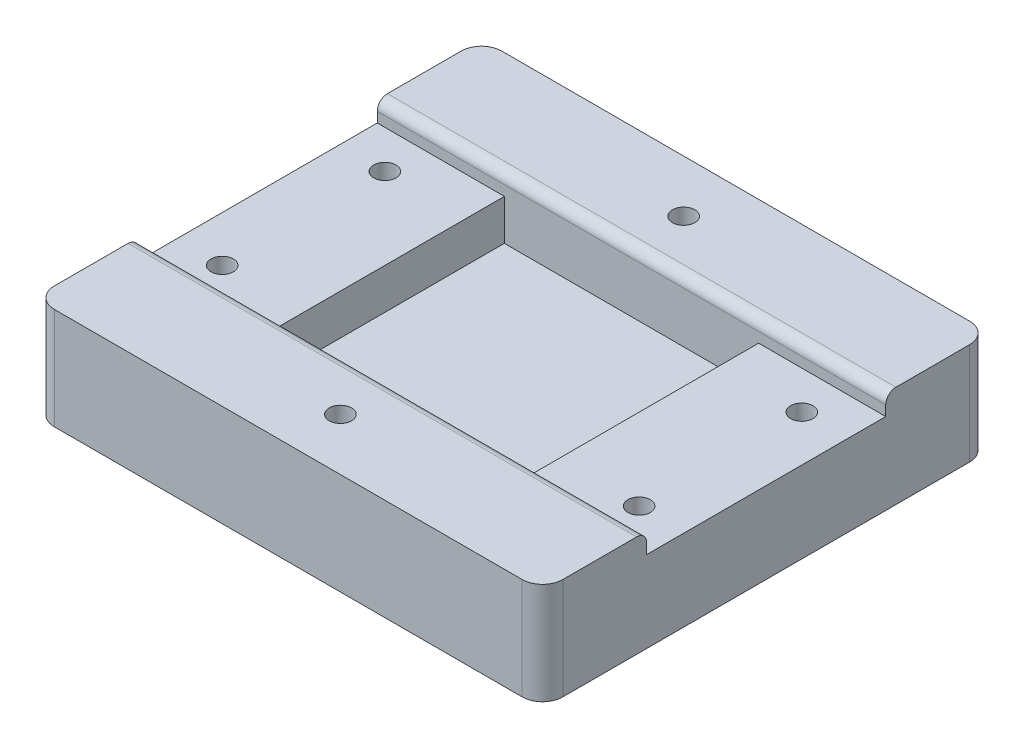
ISO-10303-21;
HEADER;
FILE_DESCRIPTION(('STEP AP214'),'2;1');
FILE_NAME('part.step','',(''),(''),'','','');
FILE_SCHEMA(('AUTOMOTIVE_DESIGN { 1 0 10303 214 1 1 1 1 }'));
ENDSEC;
DATA;
#1=APPLICATION_CONTEXT('core data for automotive mechanical design processes');
#2=APPLICATION_PROTOCOL_DEFINITION('international standard','automotive_design',2000,#1);
#3=PRODUCT_CONTEXT('',#1,'mechanical');
#4=PRODUCT('Part','Part','',(#3));
#5=PRODUCT_RELATED_PRODUCT_CATEGORY('part','',(#4));
#6=PRODUCT_DEFINITION_FORMATION('','',#4);
#7=PRODUCT_DEFINITION_CONTEXT('part definition',#1,'design');
#8=PRODUCT_DEFINITION('design','',#6,#7);
#9=PRODUCT_DEFINITION_SHAPE('','',#8);
#10=(LENGTH_UNIT() NAMED_UNIT(*) SI_UNIT(.MILLI.,.METRE.));
#11=(NAMED_UNIT(*) PLANE_ANGLE_UNIT() SI_UNIT($,.RADIAN.));
#12=(NAMED_UNIT(*) SI_UNIT($,.STERADIAN.) SOLID_ANGLE_UNIT());
#13=UNCERTAINTY_MEASURE_WITH_UNIT(LENGTH_MEASURE(1.E-05),#10,'distance_accuracy_value','');
#14=(GEOMETRIC_REPRESENTATION_CONTEXT(3) GLOBAL_UNCERTAINTY_ASSIGNED_CONTEXT((#13)) GLOBAL_UNIT_ASSIGNED_CONTEXT((#10,
#11,#12)) REPRESENTATION_CONTEXT('',''));
#15=CARTESIAN_POINT('',(0.,0.,0.));
#16=DIRECTION('',(0.,0.,1.));
#17=DIRECTION('',(1.,0.,0.));
#18=AXIS2_PLACEMENT_3D('',#15,#16,#17);
#19=CARTESIAN_POINT('',(0.,8.,0.));
#20=DIRECTION('',(0.,1.,0.));
#21=DIRECTION('',(0.,0.,1.));
#22=AXIS2_PLACEMENT_3D('',#19,#20,#21);
#23=PLANE('',#22);
#24=CARTESIAN_POINT('',(-20.5,8.,-8.));
#25=DIRECTION('',(0.,1.,0.));
#26=DIRECTION('',(0.,0.,1.));
#27=AXIS2_PLACEMENT_3D('',#24,#25,#26);
#28=CIRCLE('',#27,1.1);
#29=CARTESIAN_POINT('',(-20.5,8.,-6.9));
#30=VERTEX_POINT('',#29);
#31=EDGE_CURVE('E713',#30,#30,#28,.T.);
#32=ORIENTED_EDGE('',*,*,#31,.F.);
#33=EDGE_LOOP('',(#32));
#34=FACE_BOUND('',#33,.T.);
#35=CARTESIAN_POINT('',(-20.5,8.,8.));
#36=DIRECTION('',(0.,1.,0.));
#37=DIRECTION('',(0.,0.,1.));
#38=AXIS2_PLACEMENT_3D('',#35,#36,#37);
#39=CIRCLE('',#38,1.1);
#40=CARTESIAN_POINT('',(-20.5,8.,9.1));
#41=VERTEX_POINT('',#40);
#42=EDGE_CURVE('E199',#41,#41,#39,.T.);
#43=ORIENTED_EDGE('',*,*,#42,.F.);
#44=EDGE_LOOP('',(#43));
#45=FACE_BOUND('',#44,.T.);
#46=DIRECTION('',(0.,0.,1.));
#47=VECTOR('',#46,1.);
#48=CARTESIAN_POINT('',(-12.5,8.,11.75));
#49=LINE('',#48,#47);
#50=CARTESIAN_POINT('',(-12.5,8.,-11.75));
#51=VERTEX_POINT('',#50);
#52=CARTESIAN_POINT('',(-12.5,8.,11.75));
#53=VERTEX_POINT('',#52);
#54=EDGE_CURVE('E171',#51,#53,#49,.T.);
#55=ORIENTED_EDGE('',*,*,#54,.F.);
#56=DIRECTION('',(-1.,0.,0.));
#57=VECTOR('',#56,1.);
#58=CARTESIAN_POINT('',(29.,8.,-11.75));
#59=LINE('',#58,#57);
#60=CARTESIAN_POINT('',(-25.,8.,-11.75));
#61=VERTEX_POINT('',#60);
#62=EDGE_CURVE('E221',#51,#61,#59,.T.);
#63=ORIENTED_EDGE('',*,*,#62,.T.);
#64=DIRECTION('',(0.,0.,1.));
#65=VECTOR('',#64,1.);
#66=CARTESIAN_POINT('',(-25.,8.,22.));
#67=LINE('',#66,#65);
#68=CARTESIAN_POINT('',(-25.,8.,11.75));
#69=VERTEX_POINT('',#68);
#70=EDGE_CURVE('E239',#61,#69,#67,.T.);
#71=ORIENTED_EDGE('',*,*,#70,.T.);
#72=DIRECTION('',(1.,0.,0.));
#73=VECTOR('',#72,1.);
#74=CARTESIAN_POINT('',(29.,8.,11.75));
#75=LINE('',#74,#73);
#76=EDGE_CURVE('E218',#69,#53,#75,.T.);
#77=ORIENTED_EDGE('',*,*,#76,.T.);
#78=EDGE_LOOP('',(#55,#63,#71,#77));
#79=FACE_BOUND('',#78,.T.);
#80=ADVANCED_FACE('F38',(#34,#45,#79),#23,.T.);
#81=CARTESIAN_POINT('',(0.,10.,0.));
#82=DIRECTION('',(0.,1.,0.));
#83=DIRECTION('',(0.,0.,1.));
#84=AXIS2_PLACEMENT_3D('',#81,#82,#83);
#85=PLANE('',#84);
#86=CARTESIAN_POINT('',(0.,10.,-16.875));
#87=DIRECTION('',(0.,1.,0.));
#88=DIRECTION('',(0.,0.,1.));
#89=AXIS2_PLACEMENT_3D('',#86,#87,#88);
#90=CIRCLE('',#89,1.1);
#91=CARTESIAN_POINT('',(0.,10.,-15.775));
#92=VERTEX_POINT('',#91);
#93=EDGE_CURVE('E699',#92,#92,#90,.T.);
#94=ORIENTED_EDGE('',*,*,#93,.F.);
#95=EDGE_LOOP('',(#94));
#96=FACE_BOUND('',#95,.T.);
#97=DIRECTION('',(0.,0.,1.));
#98=VECTOR('',#97,1.);
#99=CARTESIAN_POINT('',(-25.,10.,22.));
#100=LINE('',#99,#98);
#101=CARTESIAN_POINT('',(-25.,10.,-20.));
#102=VERTEX_POINT('',#101);
#103=CARTESIAN_POINT('',(-25.,10.,-12.75));
#104=VERTEX_POINT('',#103);
#105=EDGE_CURVE('E244',#102,#104,#100,.T.);
#106=ORIENTED_EDGE('',*,*,#105,.T.);
#107=DIRECTION('',(-1.,0.,0.));
#108=VECTOR('',#107,1.);
#109=CARTESIAN_POINT('',(25.,10.,-12.75));
#110=LINE('',#109,#108);
#111=CARTESIAN_POINT('',(25.,10.,-12.75));
#112=VERTEX_POINT('',#111);
#113=EDGE_CURVE('E11',#104,#112,#110,.F.);
#114=ORIENTED_EDGE('',*,*,#113,.T.);
#115=DIRECTION('',(0.,0.,-1.));
#116=VECTOR('',#115,1.);
#117=CARTESIAN_POINT('',(25.,10.,22.));
#118=LINE('',#117,#116);
#119=CARTESIAN_POINT('',(25.,10.,-20.));
#120=VERTEX_POINT('',#119);
#121=EDGE_CURVE('E252',#112,#120,#118,.T.);
#122=ORIENTED_EDGE('',*,*,#121,.T.);
#123=CARTESIAN_POINT('',(23.,10.,-20.));
#124=DIRECTION('',(0.,1.,0.));
#125=DIRECTION('',(0.,0.,1.));
#126=AXIS2_PLACEMENT_3D('',#123,#124,#125);
#127=CIRCLE('',#126,2.);
#128=CARTESIAN_POINT('',(23.,10.,-22.));
#129=VERTEX_POINT('',#128);
#130=EDGE_CURVE('E307',#120,#129,#127,.T.);
#131=ORIENTED_EDGE('',*,*,#130,.T.);
#132=DIRECTION('',(-1.,0.,0.));
#133=VECTOR('',#132,1.);
#134=CARTESIAN_POINT('',(25.,10.,-22.));
#135=LINE('',#134,#133);
#136=CARTESIAN_POINT('',(-23.,10.,-22.));
#137=VERTEX_POINT('',#136);
#138=EDGE_CURVE('E257',#129,#137,#135,.T.);
#139=ORIENTED_EDGE('',*,*,#138,.T.);
#140=CARTESIAN_POINT('',(-23.,10.,-20.));
#141=DIRECTION('',(0.,1.,0.));
#142=DIRECTION('',(0.,0.,1.));
#143=AXIS2_PLACEMENT_3D('',#140,#141,#142);
#144=CIRCLE('',#143,2.);
#145=EDGE_CURVE('E310',#137,#102,#144,.T.);
#146=ORIENTED_EDGE('',*,*,#145,.T.);
#147=EDGE_LOOP('',(#106,#114,#122,#131,#139,#146));
#148=FACE_BOUND('',#147,.T.);
#149=ADVANCED_FACE('F398',(#96,#148),#85,.T.);
#150=CARTESIAN_POINT('',(-25.,10.,22.));
#151=DIRECTION('',(1.,0.,0.));
#152=DIRECTION('',(0.,0.,-1.));
#153=AXIS2_PLACEMENT_3D('',#150,#151,#152);
#154=PLANE('',#153);
#155=CARTESIAN_POINT('',(-25.,10.,12.75));
#156=VERTEX_POINT('',#155);
#157=CARTESIAN_POINT('',(-25.,10.,20.));
#158=VERTEX_POINT('',#157);
#159=EDGE_CURVE('E248',#156,#158,#100,.T.);
#160=ORIENTED_EDGE('',*,*,#159,.F.);
#161=CARTESIAN_POINT('',(-25.,9.,12.75));
#162=DIRECTION('',(1.,0.,0.));
#163=DIRECTION('',(0.,0.,-1.));
#164=AXIS2_PLACEMENT_3D('',#161,#162,#163);
#165=CIRCLE('',#164,1.);
#166=CARTESIAN_POINT('',(-25.,9.,11.75));
#167=VERTEX_POINT('',#166);
#168=EDGE_CURVE('E349',#156,#167,#165,.F.);
#169=ORIENTED_EDGE('',*,*,#168,.T.);
#170=DIRECTION('',(0.,-1.,0.));
#171=VECTOR('',#170,1.);
#172=CARTESIAN_POINT('',(-25.,10.,11.75));
#173=LINE('',#172,#171);
#174=EDGE_CURVE('E230',#167,#69,#173,.T.);
#175=ORIENTED_EDGE('',*,*,#174,.T.);
#176=ORIENTED_EDGE('',*,*,#70,.F.);
#177=DIRECTION('',(0.,1.,0.));
#178=VECTOR('',#177,1.);
#179=CARTESIAN_POINT('',(-25.,10.,-11.75));
#180=LINE('',#179,#178);
#181=CARTESIAN_POINT('',(-25.,9.,-11.75));
#182=VERTEX_POINT('',#181);
#183=EDGE_CURVE('E236',#61,#182,#180,.T.);
#184=ORIENTED_EDGE('',*,*,#183,.T.);
#185=CARTESIAN_POINT('',(-25.,9.,-12.75));
#186=DIRECTION('',(1.,0.,0.));
#187=DIRECTION('',(0.,0.,-1.));
#188=AXIS2_PLACEMENT_3D('',#185,#186,#187);
#189=CIRCLE('',#188,1.);
#190=EDGE_CURVE('E54',#182,#104,#189,.F.);
#191=ORIENTED_EDGE('',*,*,#190,.T.);
#192=ORIENTED_EDGE('',*,*,#105,.F.);
#193=DIRECTION('',(0.,-1.,0.));
#194=VECTOR('',#193,1.);
#195=CARTESIAN_POINT('',(-25.,10.,-20.));
#196=LINE('',#195,#194);
#197=CARTESIAN_POINT('',(-25.,0.,-20.));
#198=VERTEX_POINT('',#197);
#199=EDGE_CURVE('E284',#102,#198,#196,.T.);
#200=ORIENTED_EDGE('',*,*,#199,.T.);
#201=DIRECTION('',(0.,0.,1.));
#202=VECTOR('',#201,1.);
#203=CARTESIAN_POINT('',(-25.,0.,22.));
#204=LINE('',#203,#202);
#205=CARTESIAN_POINT('',(-25.,0.,20.));
#206=VERTEX_POINT('',#205);
#207=EDGE_CURVE('E243',#198,#206,#204,.T.);
#208=ORIENTED_EDGE('',*,*,#207,.T.);
#209=DIRECTION('',(0.,-1.,0.));
#210=VECTOR('',#209,1.);
#211=CARTESIAN_POINT('',(-25.,10.,20.));
#212=LINE('',#211,#210);
#213=EDGE_CURVE('E280',#206,#158,#212,.F.);
#214=ORIENTED_EDGE('',*,*,#213,.T.);
#215=EDGE_LOOP('',(#160,#169,#175,#176,#184,#191,#192,#200,#208,#214));
#216=FACE_BOUND('',#215,.T.);
#217=ADVANCED_FACE('F361',(#216),#154,.F.);
#218=CARTESIAN_POINT('',(25.,10.,22.));
#219=DIRECTION('',(0.,0.,-1.));
#220=DIRECTION('',(-1.,0.,0.));
#221=AXIS2_PLACEMENT_3D('',#218,#219,#220);
#222=PLANE('',#221);
#223=DIRECTION('',(1.,0.,0.));
#224=VECTOR('',#223,1.);
#225=CARTESIAN_POINT('',(25.,10.,22.));
#226=LINE('',#225,#224);
#227=CARTESIAN_POINT('',(-23.,10.,22.));
#228=VERTEX_POINT('',#227);
#229=CARTESIAN_POINT('',(23.,10.,22.));
#230=VERTEX_POINT('',#229);
#231=EDGE_CURVE('E247',#228,#230,#226,.T.);
#232=ORIENTED_EDGE('',*,*,#231,.F.);
#233=DIRECTION('',(0.,-1.,0.));
#234=VECTOR('',#233,1.);
#235=CARTESIAN_POINT('',(-23.,10.,22.));
#236=LINE('',#235,#234);
#237=CARTESIAN_POINT('',(-23.,0.,22.));
#238=VERTEX_POINT('',#237);
#239=EDGE_CURVE('E316',#228,#238,#236,.T.);
#240=ORIENTED_EDGE('',*,*,#239,.T.);
#241=DIRECTION('',(1.,0.,0.));
#242=VECTOR('',#241,1.);
#243=CARTESIAN_POINT('',(25.,0.,22.));
#244=LINE('',#243,#242);
#245=CARTESIAN_POINT('',(23.,0.,22.));
#246=VERTEX_POINT('',#245);
#247=EDGE_CURVE('E265',#238,#246,#244,.T.);
#248=ORIENTED_EDGE('',*,*,#247,.T.);
#249=DIRECTION('',(0.,-1.,0.));
#250=VECTOR('',#249,1.);
#251=CARTESIAN_POINT('',(23.,10.,22.));
#252=LINE('',#251,#250);
#253=EDGE_CURVE('E313',#246,#230,#252,.F.);
#254=ORIENTED_EDGE('',*,*,#253,.T.);
#255=EDGE_LOOP('',(#232,#240,#248,#254));
#256=FACE_BOUND('',#255,.T.);
#257=ADVANCED_FACE('F408',(#256),#222,.F.);
#258=CARTESIAN_POINT('',(25.,10.,22.));
#259=DIRECTION('',(-1.,0.,0.));
#260=DIRECTION('',(0.,0.,1.));
#261=AXIS2_PLACEMENT_3D('',#258,#259,#260);
#262=PLANE('',#261);
#263=DIRECTION('',(0.,1.,0.));
#264=VECTOR('',#263,1.);
#265=CARTESIAN_POINT('',(25.,10.,11.75));
#266=LINE('',#265,#264);
#267=CARTESIAN_POINT('',(25.,8.,11.75));
#268=VERTEX_POINT('',#267);
#269=CARTESIAN_POINT('',(25.,9.,11.75));
#270=VERTEX_POINT('',#269);
#271=EDGE_CURVE('E226',#268,#270,#266,.T.);
#272=ORIENTED_EDGE('',*,*,#271,.T.);
#273=CARTESIAN_POINT('',(25.,9.,12.75));
#274=DIRECTION('',(-1.,0.,0.));
#275=DIRECTION('',(0.,0.,1.));
#276=AXIS2_PLACEMENT_3D('',#273,#274,#275);
#277=CIRCLE('',#276,1.);
#278=CARTESIAN_POINT('',(25.,10.,12.75));
#279=VERTEX_POINT('',#278);
#280=EDGE_CURVE('E341',#270,#279,#277,.F.);
#281=ORIENTED_EDGE('',*,*,#280,.T.);
#282=CARTESIAN_POINT('',(25.,10.,20.));
#283=VERTEX_POINT('',#282);
#284=EDGE_CURVE('E253',#283,#279,#118,.T.);
#285=ORIENTED_EDGE('',*,*,#284,.F.);
#286=DIRECTION('',(0.,-1.,0.));
#287=VECTOR('',#286,1.);
#288=CARTESIAN_POINT('',(25.,10.,20.));
#289=LINE('',#288,#287);
#290=CARTESIAN_POINT('',(25.,0.,20.));
#291=VERTEX_POINT('',#290);
#292=EDGE_CURVE('E330',#283,#291,#289,.T.);
#293=ORIENTED_EDGE('',*,*,#292,.T.);
#294=DIRECTION('',(0.,0.,-1.));
#295=VECTOR('',#294,1.);
#296=CARTESIAN_POINT('',(25.,0.,22.));
#297=LINE('',#296,#295);
#298=CARTESIAN_POINT('',(25.,0.,-20.));
#299=VERTEX_POINT('',#298);
#300=EDGE_CURVE('E269',#291,#299,#297,.T.);
#301=ORIENTED_EDGE('',*,*,#300,.T.);
#302=DIRECTION('',(0.,-1.,0.));
#303=VECTOR('',#302,1.);
#304=CARTESIAN_POINT('',(25.,10.,-20.));
#305=LINE('',#304,#303);
#306=EDGE_CURVE('E326',#299,#120,#305,.F.);
#307=ORIENTED_EDGE('',*,*,#306,.T.);
#308=ORIENTED_EDGE('',*,*,#121,.F.);
#309=CARTESIAN_POINT('',(25.,9.,-12.75));
#310=DIRECTION('',(-1.,0.,0.));
#311=DIRECTION('',(0.,0.,1.));
#312=AXIS2_PLACEMENT_3D('',#309,#310,#311);
#313=CIRCLE('',#312,1.);
#314=CARTESIAN_POINT('',(25.,9.,-11.75));
#315=VERTEX_POINT('',#314);
#316=EDGE_CURVE('E338',#112,#315,#313,.F.);
#317=ORIENTED_EDGE('',*,*,#316,.T.);
#318=DIRECTION('',(0.,-1.,0.));
#319=VECTOR('',#318,1.);
#320=CARTESIAN_POINT('',(25.,10.,-11.75));
#321=LINE('',#320,#319);
#322=CARTESIAN_POINT('',(25.,8.,-11.75));
#323=VERTEX_POINT('',#322);
#324=EDGE_CURVE('E233',#315,#323,#321,.T.);
#325=ORIENTED_EDGE('',*,*,#324,.T.);
#326=DIRECTION('',(0.,0.,-1.));
#327=VECTOR('',#326,1.);
#328=CARTESIAN_POINT('',(25.,8.,22.));
#329=LINE('',#328,#327);
#330=EDGE_CURVE('E261',#268,#323,#329,.T.);
#331=ORIENTED_EDGE('',*,*,#330,.F.);
#332=EDGE_LOOP('',(#272,#281,#285,#293,#301,#307,#308,#317,#325,#331));
#333=FACE_BOUND('',#332,.T.);
#334=ADVANCED_FACE('F371',(#333),#262,.F.);
#335=CARTESIAN_POINT('',(25.,10.,-22.));
#336=DIRECTION('',(0.,0.,1.));
#337=DIRECTION('',(1.,0.,0.));
#338=AXIS2_PLACEMENT_3D('',#335,#336,#337);
#339=PLANE('',#338);
#340=DIRECTION('',(-1.,0.,0.));
#341=VECTOR('',#340,1.);
#342=CARTESIAN_POINT('',(25.,0.,-22.));
#343=LINE('',#342,#341);
#344=CARTESIAN_POINT('',(23.,0.,-22.));
#345=VERTEX_POINT('',#344);
#346=CARTESIAN_POINT('',(-23.,0.,-22.));
#347=VERTEX_POINT('',#346);
#348=EDGE_CURVE('E273',#345,#347,#343,.T.);
#349=ORIENTED_EDGE('',*,*,#348,.T.);
#350=DIRECTION('',(0.,-1.,0.));
#351=VECTOR('',#350,1.);
#352=CARTESIAN_POINT('',(-23.,10.,-22.));
#353=LINE('',#352,#351);
#354=EDGE_CURVE('E304',#347,#137,#353,.F.);
#355=ORIENTED_EDGE('',*,*,#354,.T.);
#356=ORIENTED_EDGE('',*,*,#138,.F.);
#357=DIRECTION('',(0.,-1.,0.));
#358=VECTOR('',#357,1.);
#359=CARTESIAN_POINT('',(23.,10.,-22.));
#360=LINE('',#359,#358);
#361=EDGE_CURVE('E300',#129,#345,#360,.T.);
#362=ORIENTED_EDGE('',*,*,#361,.T.);
#363=EDGE_LOOP('',(#349,#355,#356,#362));
#364=FACE_BOUND('',#363,.T.);
#365=ADVANCED_FACE('F394',(#364),#339,.F.);
#366=CARTESIAN_POINT('',(0.,10.,16.875));
#367=DIRECTION('',(0.,1.,0.));
#368=DIRECTION('',(0.,0.,1.));
#369=AXIS2_PLACEMENT_3D('',#366,#367,#368);
#370=CIRCLE('',#369,1.1);
#371=CARTESIAN_POINT('',(0.,10.,17.975));
#372=VERTEX_POINT('',#371);
#373=EDGE_CURVE('E687',#372,#372,#370,.T.);
#374=ORIENTED_EDGE('',*,*,#373,.F.);
#375=EDGE_LOOP('',(#374));
#376=FACE_BOUND('',#375,.T.);
#377=ORIENTED_EDGE('',*,*,#284,.T.);
#378=DIRECTION('',(1.,0.,0.));
#379=VECTOR('',#378,1.);
#380=CARTESIAN_POINT('',(-25.,10.,12.75));
#381=LINE('',#380,#379);
#382=EDGE_CURVE('E344',#279,#156,#381,.F.);
#383=ORIENTED_EDGE('',*,*,#382,.T.);
#384=ORIENTED_EDGE('',*,*,#159,.T.);
#385=CARTESIAN_POINT('',(-23.,10.,20.));
#386=DIRECTION('',(0.,1.,0.));
#387=DIRECTION('',(0.,0.,1.));
#388=AXIS2_PLACEMENT_3D('',#385,#386,#387);
#389=CIRCLE('',#388,2.);
#390=EDGE_CURVE('E323',#158,#228,#389,.T.);
#391=ORIENTED_EDGE('',*,*,#390,.T.);
#392=ORIENTED_EDGE('',*,*,#231,.T.);
#393=CARTESIAN_POINT('',(23.,10.,20.));
#394=DIRECTION('',(0.,1.,0.));
#395=DIRECTION('',(0.,0.,1.));
#396=AXIS2_PLACEMENT_3D('',#393,#394,#395);
#397=CIRCLE('',#396,2.);
#398=EDGE_CURVE('E320',#230,#283,#397,.T.);
#399=ORIENTED_EDGE('',*,*,#398,.T.);
#400=EDGE_LOOP('',(#377,#383,#384,#391,#392,#399));
#401=FACE_BOUND('',#400,.T.);
#402=ADVANCED_FACE('F375',(#376,#401),#85,.T.);
#403=CARTESIAN_POINT('',(0.,0.,0.));
#404=DIRECTION('',(0.,1.,0.));
#405=DIRECTION('',(0.,0.,1.));
#406=AXIS2_PLACEMENT_3D('',#403,#404,#405);
#407=PLANE('',#406);
#408=ORIENTED_EDGE('',*,*,#207,.F.);
#409=CARTESIAN_POINT('',(-23.,0.,-20.));
#410=DIRECTION('',(0.,1.,0.));
#411=DIRECTION('',(0.,0.,1.));
#412=AXIS2_PLACEMENT_3D('',#409,#410,#411);
#413=CIRCLE('',#412,2.);
#414=EDGE_CURVE('E297',#198,#347,#413,.F.);
#415=ORIENTED_EDGE('',*,*,#414,.T.);
#416=ORIENTED_EDGE('',*,*,#348,.F.);
#417=CARTESIAN_POINT('',(23.,0.,-20.));
#418=DIRECTION('',(0.,1.,0.));
#419=DIRECTION('',(0.,0.,1.));
#420=AXIS2_PLACEMENT_3D('',#417,#418,#419);
#421=CIRCLE('',#420,2.);
#422=EDGE_CURVE('E288',#345,#299,#421,.F.);
#423=ORIENTED_EDGE('',*,*,#422,.T.);
#424=ORIENTED_EDGE('',*,*,#300,.F.);
#425=CARTESIAN_POINT('',(23.,0.,20.));
#426=DIRECTION('',(0.,1.,0.));
#427=DIRECTION('',(0.,0.,1.));
#428=AXIS2_PLACEMENT_3D('',#425,#426,#427);
#429=CIRCLE('',#428,2.);
#430=EDGE_CURVE('E291',#291,#246,#429,.F.);
#431=ORIENTED_EDGE('',*,*,#430,.T.);
#432=ORIENTED_EDGE('',*,*,#247,.F.);
#433=CARTESIAN_POINT('',(-23.,0.,20.));
#434=DIRECTION('',(0.,1.,0.));
#435=DIRECTION('',(0.,0.,1.));
#436=AXIS2_PLACEMENT_3D('',#433,#434,#435);
#437=CIRCLE('',#436,2.);
#438=EDGE_CURVE('E294',#238,#206,#437,.F.);
#439=ORIENTED_EDGE('',*,*,#438,.T.);
#440=EDGE_LOOP('',(#408,#415,#416,#423,#424,#431,#432,#439));
#441=FACE_BOUND('',#440,.T.);
#442=ADVANCED_FACE('F385',(#441),#407,.F.);
#443=CARTESIAN_POINT('',(20.5,8.,8.));
#444=DIRECTION('',(0.,1.,0.));
#445=DIRECTION('',(0.,0.,1.));
#446=AXIS2_PLACEMENT_3D('',#443,#444,#445);
#447=CIRCLE('',#446,1.1);
#448=CARTESIAN_POINT('',(20.5,8.,9.1));
#449=VERTEX_POINT('',#448);
#450=EDGE_CURVE('E445',#449,#449,#447,.T.);
#451=ORIENTED_EDGE('',*,*,#450,.F.);
#452=EDGE_LOOP('',(#451));
#453=FACE_BOUND('',#452,.T.);
#454=CARTESIAN_POINT('',(20.5,8.,-8.));
#455=DIRECTION('',(0.,1.,0.));
#456=DIRECTION('',(0.,0.,1.));
#457=AXIS2_PLACEMENT_3D('',#454,#455,#456);
#458=CIRCLE('',#457,1.1);
#459=CARTESIAN_POINT('',(20.5,8.,-6.9));
#460=VERTEX_POINT('',#459);
#461=EDGE_CURVE('E449',#460,#460,#458,.T.);
#462=ORIENTED_EDGE('',*,*,#461,.F.);
#463=EDGE_LOOP('',(#462));
#464=FACE_BOUND('',#463,.T.);
#465=DIRECTION('',(0.,0.,-1.));
#466=VECTOR('',#465,1.);
#467=CARTESIAN_POINT('',(12.5,8.,11.75));
#468=LINE('',#467,#466);
#469=CARTESIAN_POINT('',(12.5,8.,11.75));
#470=VERTEX_POINT('',#469);
#471=CARTESIAN_POINT('',(12.5,8.,-11.75));
#472=VERTEX_POINT('',#471);
#473=EDGE_CURVE('E193',#470,#472,#468,.T.);
#474=ORIENTED_EDGE('',*,*,#473,.F.);
#475=EDGE_CURVE('E212',#470,#268,#75,.T.);
#476=ORIENTED_EDGE('',*,*,#475,.T.);
#477=ORIENTED_EDGE('',*,*,#330,.T.);
#478=EDGE_CURVE('E222',#323,#472,#59,.T.);
#479=ORIENTED_EDGE('',*,*,#478,.T.);
#480=EDGE_LOOP('',(#474,#476,#477,#479));
#481=FACE_BOUND('',#480,.T.);
#482=ADVANCED_FACE('F422',(#453,#464,#481),#23,.T.);
#483=CARTESIAN_POINT('',(29.,8.,-11.75));
#484=DIRECTION('',(0.,0.,-1.));
#485=DIRECTION('',(-1.,0.,0.));
#486=AXIS2_PLACEMENT_3D('',#483,#484,#485);
#487=PLANE('',#486);
#488=ORIENTED_EDGE('',*,*,#324,.F.);
#489=DIRECTION('',(-1.,0.,0.));
#490=VECTOR('',#489,1.);
#491=CARTESIAN_POINT('',(-25.,9.,-11.75));
#492=LINE('',#491,#490);
#493=EDGE_CURVE('E47',#315,#182,#492,.T.);
#494=ORIENTED_EDGE('',*,*,#493,.T.);
#495=ORIENTED_EDGE('',*,*,#183,.F.);
#496=ORIENTED_EDGE('',*,*,#62,.F.);
#497=DIRECTION('',(0.,1.,0.));
#498=VECTOR('',#497,1.);
#499=CARTESIAN_POINT('',(-12.5,4.,-11.75));
#500=LINE('',#499,#498);
#501=CARTESIAN_POINT('',(-12.5,4.,-11.75));
#502=VERTEX_POINT('',#501);
#503=EDGE_CURVE('E209',#502,#51,#500,.T.);
#504=ORIENTED_EDGE('',*,*,#503,.F.);
#505=DIRECTION('',(-1.,0.,0.));
#506=VECTOR('',#505,1.);
#507=CARTESIAN_POINT('',(12.5,4.,-11.75));
#508=LINE('',#507,#506);
#509=CARTESIAN_POINT('',(12.5,4.,-11.75));
#510=VERTEX_POINT('',#509);
#511=EDGE_CURVE('E177',#510,#502,#508,.T.);
#512=ORIENTED_EDGE('',*,*,#511,.F.);
#513=DIRECTION('',(0.,1.,0.));
#514=VECTOR('',#513,1.);
#515=CARTESIAN_POINT('',(12.5,4.,-11.75));
#516=LINE('',#515,#514);
#517=EDGE_CURVE('E213',#510,#472,#516,.T.);
#518=ORIENTED_EDGE('',*,*,#517,.T.);
#519=ORIENTED_EDGE('',*,*,#478,.F.);
#520=EDGE_LOOP('',(#488,#494,#495,#496,#504,#512,#518,#519));
#521=FACE_BOUND('',#520,.T.);
#522=ADVANCED_FACE('F355',(#521),#487,.F.);
#523=CARTESIAN_POINT('',(29.,8.,11.75));
#524=DIRECTION('',(0.,0.,1.));
#525=DIRECTION('',(1.,0.,0.));
#526=AXIS2_PLACEMENT_3D('',#523,#524,#525);
#527=PLANE('',#526);
#528=ORIENTED_EDGE('',*,*,#174,.F.);
#529=DIRECTION('',(1.,0.,0.));
#530=VECTOR('',#529,1.);
#531=CARTESIAN_POINT('',(25.,9.,11.75));
#532=LINE('',#531,#530);
#533=EDGE_CURVE('E334',#167,#270,#532,.T.);
#534=ORIENTED_EDGE('',*,*,#533,.T.);
#535=ORIENTED_EDGE('',*,*,#271,.F.);
#536=ORIENTED_EDGE('',*,*,#475,.F.);
#537=DIRECTION('',(0.,1.,0.));
#538=VECTOR('',#537,1.);
#539=CARTESIAN_POINT('',(12.5,4.,11.75));
#540=LINE('',#539,#538);
#541=CARTESIAN_POINT('',(12.5,4.,11.75));
#542=VERTEX_POINT('',#541);
#543=EDGE_CURVE('E176',#542,#470,#540,.T.);
#544=ORIENTED_EDGE('',*,*,#543,.F.);
#545=DIRECTION('',(1.,0.,0.));
#546=VECTOR('',#545,1.);
#547=CARTESIAN_POINT('',(12.5,4.,11.75));
#548=LINE('',#547,#546);
#549=CARTESIAN_POINT('',(-12.5,4.,11.75));
#550=VERTEX_POINT('',#549);
#551=EDGE_CURVE('E180',#550,#542,#548,.T.);
#552=ORIENTED_EDGE('',*,*,#551,.F.);
#553=DIRECTION('',(0.,1.,0.));
#554=VECTOR('',#553,1.);
#555=CARTESIAN_POINT('',(-12.5,4.,11.75));
#556=LINE('',#555,#554);
#557=EDGE_CURVE('E164',#550,#53,#556,.T.);
#558=ORIENTED_EDGE('',*,*,#557,.T.);
#559=ORIENTED_EDGE('',*,*,#76,.F.);
#560=EDGE_LOOP('',(#528,#534,#535,#536,#544,#552,#558,#559));
#561=FACE_BOUND('',#560,.T.);
#562=ADVANCED_FACE('F182',(#561),#527,.F.);
#563=CARTESIAN_POINT('',(-12.5,4.,11.75));
#564=DIRECTION('',(-1.,0.,0.));
#565=DIRECTION('',(0.,0.,1.));
#566=AXIS2_PLACEMENT_3D('',#563,#564,#565);
#567=PLANE('',#566);
#568=ORIENTED_EDGE('',*,*,#54,.T.);
#569=ORIENTED_EDGE('',*,*,#557,.F.);
#570=DIRECTION('',(0.,0.,1.));
#571=VECTOR('',#570,1.);
#572=CARTESIAN_POINT('',(-12.5,4.,11.75));
#573=LINE('',#572,#571);
#574=EDGE_CURVE('E168',#502,#550,#573,.T.);
#575=ORIENTED_EDGE('',*,*,#574,.F.);
#576=ORIENTED_EDGE('',*,*,#503,.T.);
#577=EDGE_LOOP('',(#568,#569,#575,#576));
#578=FACE_BOUND('',#577,.T.);
#579=ADVANCED_FACE('F166',(#578),#567,.F.);
#580=CARTESIAN_POINT('',(12.5,4.,11.75));
#581=DIRECTION('',(1.,0.,0.));
#582=DIRECTION('',(0.,0.,-1.));
#583=AXIS2_PLACEMENT_3D('',#580,#581,#582);
#584=PLANE('',#583);
#585=ORIENTED_EDGE('',*,*,#473,.T.);
#586=ORIENTED_EDGE('',*,*,#517,.F.);
#587=DIRECTION('',(0.,0.,-1.));
#588=VECTOR('',#587,1.);
#589=CARTESIAN_POINT('',(12.5,4.,11.75));
#590=LINE('',#589,#588);
#591=EDGE_CURVE('E188',#542,#510,#590,.T.);
#592=ORIENTED_EDGE('',*,*,#591,.F.);
#593=ORIENTED_EDGE('',*,*,#543,.T.);
#594=EDGE_LOOP('',(#585,#586,#592,#593));
#595=FACE_BOUND('',#594,.T.);
#596=ADVANCED_FACE('F522',(#595),#584,.F.);
#597=CARTESIAN_POINT('',(0.,4.,0.));
#598=DIRECTION('',(0.,1.,0.));
#599=DIRECTION('',(0.,0.,1.));
#600=AXIS2_PLACEMENT_3D('',#597,#598,#599);
#601=PLANE('',#600);
#602=ORIENTED_EDGE('',*,*,#574,.T.);
#603=ORIENTED_EDGE('',*,*,#551,.T.);
#604=ORIENTED_EDGE('',*,*,#591,.T.);
#605=ORIENTED_EDGE('',*,*,#511,.T.);
#606=EDGE_LOOP('',(#602,#603,#604,#605));
#607=FACE_BOUND('',#606,.T.);
#608=ADVANCED_FACE('F190',(#607),#601,.T.);
#609=CARTESIAN_POINT('',(20.5,3.,-8.));
#610=DIRECTION('',(0.,1.,0.));
#611=DIRECTION('',(0.,0.,1.));
#612=AXIS2_PLACEMENT_3D('',#609,#610,#611);
#613=CYLINDRICAL_SURFACE('',#612,1.1);
#614=CARTESIAN_POINT('',(20.5,3.,-8.));
#615=DIRECTION('',(0.,1.,0.));
#616=DIRECTION('',(0.,0.,1.));
#617=AXIS2_PLACEMENT_3D('',#614,#615,#616);
#618=CIRCLE('',#617,1.1);
#619=CARTESIAN_POINT('',(20.5,3.,-6.9));
#620=VERTEX_POINT('',#619);
#621=EDGE_CURVE('E703',#620,#620,#618,.T.);
#622=ORIENTED_EDGE('',*,*,#621,.F.);
#623=EDGE_LOOP('',(#622));
#624=FACE_BOUND('',#623,.T.);
#625=ORIENTED_EDGE('',*,*,#461,.T.);
#626=EDGE_LOOP('',(#625));
#627=FACE_BOUND('',#626,.T.);
#628=ADVANCED_FACE('F492',(#624,#627),#613,.F.);
#629=CARTESIAN_POINT('',(20.5,3.,-8.));
#630=DIRECTION('',(0.,1.,0.));
#631=DIRECTION('',(0.,0.,1.));
#632=AXIS2_PLACEMENT_3D('',#629,#630,#631);
#633=PLANE('',#632);
#634=ORIENTED_EDGE('',*,*,#621,.T.);
#635=EDGE_LOOP('',(#634));
#636=FACE_BOUND('',#635,.T.);
#637=ADVANCED_FACE('F488',(#636),#633,.T.);
#638=CARTESIAN_POINT('',(20.5,3.,8.));
#639=DIRECTION('',(0.,1.,0.));
#640=DIRECTION('',(0.,0.,1.));
#641=AXIS2_PLACEMENT_3D('',#638,#639,#640);
#642=CYLINDRICAL_SURFACE('',#641,1.1);
#643=CARTESIAN_POINT('',(20.5,3.,8.));
#644=DIRECTION('',(0.,1.,0.));
#645=DIRECTION('',(0.,0.,1.));
#646=AXIS2_PLACEMENT_3D('',#643,#644,#645);
#647=CIRCLE('',#646,1.1);
#648=CARTESIAN_POINT('',(20.5,3.,9.1));
#649=VERTEX_POINT('',#648);
#650=EDGE_CURVE('E691',#649,#649,#647,.T.);
#651=ORIENTED_EDGE('',*,*,#650,.F.);
#652=EDGE_LOOP('',(#651));
#653=FACE_BOUND('',#652,.T.);
#654=ORIENTED_EDGE('',*,*,#450,.T.);
#655=EDGE_LOOP('',(#654));
#656=FACE_BOUND('',#655,.T.);
#657=ADVANCED_FACE('F491',(#653,#656),#642,.F.);
#658=CARTESIAN_POINT('',(20.5,3.,8.));
#659=DIRECTION('',(0.,1.,0.));
#660=DIRECTION('',(0.,0.,1.));
#661=AXIS2_PLACEMENT_3D('',#658,#659,#660);
#662=PLANE('',#661);
#663=ORIENTED_EDGE('',*,*,#650,.T.);
#664=EDGE_LOOP('',(#663));
#665=FACE_BOUND('',#664,.T.);
#666=ADVANCED_FACE('F506',(#665),#662,.T.);
#667=CARTESIAN_POINT('',(-20.5,3.,8.));
#668=DIRECTION('',(0.,1.,0.));
#669=DIRECTION('',(0.,0.,1.));
#670=AXIS2_PLACEMENT_3D('',#667,#668,#669);
#671=CYLINDRICAL_SURFACE('',#670,1.1);
#672=CARTESIAN_POINT('',(-20.5,3.,8.));
#673=DIRECTION('',(0.,1.,0.));
#674=DIRECTION('',(0.,0.,1.));
#675=AXIS2_PLACEMENT_3D('',#672,#673,#674);
#676=CIRCLE('',#675,1.1);
#677=CARTESIAN_POINT('',(-20.5,3.,9.1));
#678=VERTEX_POINT('',#677);
#679=EDGE_CURVE('E207',#678,#678,#676,.T.);
#680=ORIENTED_EDGE('',*,*,#679,.F.);
#681=EDGE_LOOP('',(#680));
#682=FACE_BOUND('',#681,.T.);
#683=ORIENTED_EDGE('',*,*,#42,.T.);
#684=EDGE_LOOP('',(#683));
#685=FACE_BOUND('',#684,.T.);
#686=ADVANCED_FACE('F509',(#682,#685),#671,.F.);
#687=CARTESIAN_POINT('',(-20.5,3.,8.));
#688=DIRECTION('',(0.,1.,0.));
#689=DIRECTION('',(0.,0.,1.));
#690=AXIS2_PLACEMENT_3D('',#687,#688,#689);
#691=PLANE('',#690);
#692=ORIENTED_EDGE('',*,*,#679,.T.);
#693=EDGE_LOOP('',(#692));
#694=FACE_BOUND('',#693,.T.);
#695=ADVANCED_FACE('F504',(#694),#691,.T.);
#696=CARTESIAN_POINT('',(-20.5,3.,-8.));
#697=DIRECTION('',(0.,1.,0.));
#698=DIRECTION('',(0.,0.,1.));
#699=AXIS2_PLACEMENT_3D('',#696,#697,#698);
#700=CYLINDRICAL_SURFACE('',#699,1.1);
#701=CARTESIAN_POINT('',(-20.5,3.,-8.));
#702=DIRECTION('',(0.,1.,0.));
#703=DIRECTION('',(0.,0.,1.));
#704=AXIS2_PLACEMENT_3D('',#701,#702,#703);
#705=CIRCLE('',#704,1.1);
#706=CARTESIAN_POINT('',(-20.5,3.,-6.9));
#707=VERTEX_POINT('',#706);
#708=EDGE_CURVE('E709',#707,#707,#705,.T.);
#709=ORIENTED_EDGE('',*,*,#708,.F.);
#710=EDGE_LOOP('',(#709));
#711=FACE_BOUND('',#710,.T.);
#712=ORIENTED_EDGE('',*,*,#31,.T.);
#713=EDGE_LOOP('',(#712));
#714=FACE_BOUND('',#713,.T.);
#715=ADVANCED_FACE('F500',(#711,#714),#700,.F.);
#716=CARTESIAN_POINT('',(-20.5,3.,-8.));
#717=DIRECTION('',(0.,1.,0.));
#718=DIRECTION('',(0.,0.,1.));
#719=AXIS2_PLACEMENT_3D('',#716,#717,#718);
#720=PLANE('',#719);
#721=ORIENTED_EDGE('',*,*,#708,.T.);
#722=EDGE_LOOP('',(#721));
#723=FACE_BOUND('',#722,.T.);
#724=ADVANCED_FACE('F497',(#723),#720,.T.);
#725=CARTESIAN_POINT('',(0.,5.,16.875));
#726=DIRECTION('',(0.,1.,0.));
#727=DIRECTION('',(0.,0.,1.));
#728=AXIS2_PLACEMENT_3D('',#725,#726,#727);
#729=CYLINDRICAL_SURFACE('',#728,1.1);
#730=CARTESIAN_POINT('',(0.,5.,16.875));
#731=DIRECTION('',(0.,1.,0.));
#732=DIRECTION('',(0.,0.,1.));
#733=AXIS2_PLACEMENT_3D('',#730,#731,#732);
#734=CIRCLE('',#733,1.1);
#735=CARTESIAN_POINT('',(0.,5.,17.975));
#736=VERTEX_POINT('',#735);
#737=EDGE_CURVE('E685',#736,#736,#734,.T.);
#738=ORIENTED_EDGE('',*,*,#737,.F.);
#739=EDGE_LOOP('',(#738));
#740=FACE_BOUND('',#739,.T.);
#741=ORIENTED_EDGE('',*,*,#373,.T.);
#742=EDGE_LOOP('',(#741));
#743=FACE_BOUND('',#742,.T.);
#744=ADVANCED_FACE('F485',(#740,#743),#729,.F.);
#745=CARTESIAN_POINT('',(0.,5.,16.875));
#746=DIRECTION('',(0.,1.,0.));
#747=DIRECTION('',(0.,0.,1.));
#748=AXIS2_PLACEMENT_3D('',#745,#746,#747);
#749=PLANE('',#748);
#750=ORIENTED_EDGE('',*,*,#737,.T.);
#751=EDGE_LOOP('',(#750));
#752=FACE_BOUND('',#751,.T.);
#753=ADVANCED_FACE('F480',(#752),#749,.T.);
#754=CARTESIAN_POINT('',(0.,5.,-16.875));
#755=DIRECTION('',(0.,1.,0.));
#756=DIRECTION('',(0.,0.,1.));
#757=AXIS2_PLACEMENT_3D('',#754,#755,#756);
#758=CYLINDRICAL_SURFACE('',#757,1.1);
#759=CARTESIAN_POINT('',(0.,5.,-16.875));
#760=DIRECTION('',(0.,1.,0.));
#761=DIRECTION('',(0.,0.,1.));
#762=AXIS2_PLACEMENT_3D('',#759,#760,#761);
#763=CIRCLE('',#762,1.1);
#764=CARTESIAN_POINT('',(0.,5.,-15.775));
#765=VERTEX_POINT('',#764);
#766=EDGE_CURVE('E694',#765,#765,#763,.T.);
#767=ORIENTED_EDGE('',*,*,#766,.F.);
#768=EDGE_LOOP('',(#767));
#769=FACE_BOUND('',#768,.T.);
#770=ORIENTED_EDGE('',*,*,#93,.T.);
#771=EDGE_LOOP('',(#770));
#772=FACE_BOUND('',#771,.T.);
#773=ADVANCED_FACE('F475',(#769,#772),#758,.F.);
#774=CARTESIAN_POINT('',(0.,5.,-16.875));
#775=DIRECTION('',(0.,1.,0.));
#776=DIRECTION('',(0.,0.,1.));
#777=AXIS2_PLACEMENT_3D('',#774,#775,#776);
#778=PLANE('',#777);
#779=ORIENTED_EDGE('',*,*,#766,.T.);
#780=EDGE_LOOP('',(#779));
#781=FACE_BOUND('',#780,.T.);
#782=ADVANCED_FACE('F471',(#781),#778,.T.);
#783=CARTESIAN_POINT('',(-23.,10.,-20.));
#784=DIRECTION('',(0.,-1.,0.));
#785=DIRECTION('',(0.,0.,-1.));
#786=AXIS2_PLACEMENT_3D('',#783,#784,#785);
#787=CYLINDRICAL_SURFACE('',#786,2.);
#788=ORIENTED_EDGE('',*,*,#145,.F.);
#789=ORIENTED_EDGE('',*,*,#354,.F.);
#790=ORIENTED_EDGE('',*,*,#414,.F.);
#791=ORIENTED_EDGE('',*,*,#199,.F.);
#792=EDGE_LOOP('',(#788,#789,#790,#791));
#793=FACE_BOUND('',#792,.T.);
#794=ADVANCED_FACE('F401',(#793),#787,.T.);
#795=CARTESIAN_POINT('',(-23.,10.,20.));
#796=DIRECTION('',(0.,-1.,0.));
#797=DIRECTION('',(0.,0.,-1.));
#798=AXIS2_PLACEMENT_3D('',#795,#796,#797);
#799=CYLINDRICAL_SURFACE('',#798,2.);
#800=ORIENTED_EDGE('',*,*,#390,.F.);
#801=ORIENTED_EDGE('',*,*,#213,.F.);
#802=ORIENTED_EDGE('',*,*,#438,.F.);
#803=ORIENTED_EDGE('',*,*,#239,.F.);
#804=EDGE_LOOP('',(#800,#801,#802,#803));
#805=FACE_BOUND('',#804,.T.);
#806=ADVANCED_FACE('F406',(#805),#799,.T.);
#807=CARTESIAN_POINT('',(23.,10.,20.));
#808=DIRECTION('',(0.,-1.,0.));
#809=DIRECTION('',(0.,0.,-1.));
#810=AXIS2_PLACEMENT_3D('',#807,#808,#809);
#811=CYLINDRICAL_SURFACE('',#810,2.);
#812=ORIENTED_EDGE('',*,*,#398,.F.);
#813=ORIENTED_EDGE('',*,*,#253,.F.);
#814=ORIENTED_EDGE('',*,*,#430,.F.);
#815=ORIENTED_EDGE('',*,*,#292,.F.);
#816=EDGE_LOOP('',(#812,#813,#814,#815));
#817=FACE_BOUND('',#816,.T.);
#818=ADVANCED_FACE('F380',(#817),#811,.T.);
#819=CARTESIAN_POINT('',(23.,10.,-20.));
#820=DIRECTION('',(0.,-1.,0.));
#821=DIRECTION('',(0.,0.,-1.));
#822=AXIS2_PLACEMENT_3D('',#819,#820,#821);
#823=CYLINDRICAL_SURFACE('',#822,2.);
#824=ORIENTED_EDGE('',*,*,#130,.F.);
#825=ORIENTED_EDGE('',*,*,#306,.F.);
#826=ORIENTED_EDGE('',*,*,#422,.F.);
#827=ORIENTED_EDGE('',*,*,#361,.F.);
#828=EDGE_LOOP('',(#824,#825,#826,#827));
#829=FACE_BOUND('',#828,.T.);
#830=ADVANCED_FACE('F391',(#829),#823,.T.);
#831=CARTESIAN_POINT('',(29.,9.,12.75));
#832=DIRECTION('',(-1.,0.,0.));
#833=DIRECTION('',(0.,0.,1.));
#834=AXIS2_PLACEMENT_3D('',#831,#832,#833);
#835=CYLINDRICAL_SURFACE('',#834,1.);
#836=ORIENTED_EDGE('',*,*,#168,.F.);
#837=ORIENTED_EDGE('',*,*,#382,.F.);
#838=ORIENTED_EDGE('',*,*,#280,.F.);
#839=ORIENTED_EDGE('',*,*,#533,.F.);
#840=EDGE_LOOP('',(#836,#837,#838,#839));
#841=FACE_BOUND('',#840,.T.);
#842=ADVANCED_FACE('F367',(#841),#835,.T.);
#843=CARTESIAN_POINT('',(29.,9.,-12.75));
#844=DIRECTION('',(1.,0.,0.));
#845=DIRECTION('',(0.,0.,-1.));
#846=AXIS2_PLACEMENT_3D('',#843,#844,#845);
#847=CYLINDRICAL_SURFACE('',#846,1.);
#848=ORIENTED_EDGE('',*,*,#316,.F.);
#849=ORIENTED_EDGE('',*,*,#113,.F.);
#850=ORIENTED_EDGE('',*,*,#190,.F.);
#851=ORIENTED_EDGE('',*,*,#493,.F.);
#852=EDGE_LOOP('',(#848,#849,#850,#851));
#853=FACE_BOUND('',#852,.T.);
#854=ADVANCED_FACE('F40',(#853),#847,.T.);
#855=CLOSED_SHELL('',(#80,#149,#217,#257,#334,#365,#402,#442,#482,#522,#562,#579,#596,#608,#628,
#637,#657,#666,#686,#695,#715,#724,#744,#753,#773,#782,#794,#806,#818,#830,#842,#854));
#856=MANIFOLD_SOLID_BREP('B2',#855);
#857=ADVANCED_BREP_SHAPE_REPRESENTATION('',(#18,#856),#14);
#858=SHAPE_DEFINITION_REPRESENTATION(#9,#857);
ENDSEC;
END-ISO-10303-21;
